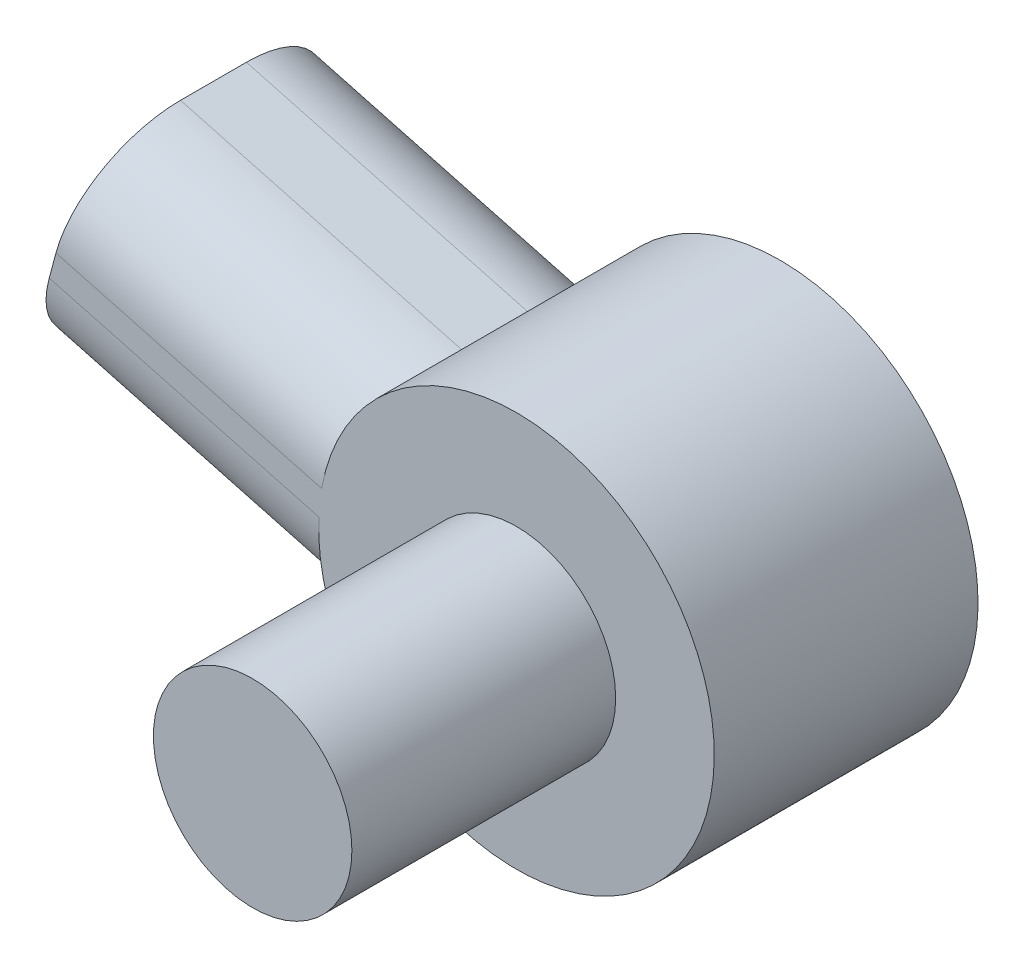
ISO-10303-21;
HEADER;
FILE_DESCRIPTION(('STEP AP214'),'2;1');
FILE_NAME('part.step','',(''),(''),'','','');
FILE_SCHEMA(('AUTOMOTIVE_DESIGN { 1 0 10303 214 1 1 1 1 }'));
ENDSEC;
DATA;
#1=APPLICATION_CONTEXT('core data for automotive mechanical design processes');
#2=APPLICATION_PROTOCOL_DEFINITION('international standard','automotive_design',2000,#1);
#3=PRODUCT_CONTEXT('',#1,'mechanical');
#4=PRODUCT('Part','Part','',(#3));
#5=PRODUCT_RELATED_PRODUCT_CATEGORY('part','',(#4));
#6=PRODUCT_DEFINITION_FORMATION('','',#4);
#7=PRODUCT_DEFINITION_CONTEXT('part definition',#1,'design');
#8=PRODUCT_DEFINITION('design','',#6,#7);
#9=PRODUCT_DEFINITION_SHAPE('','',#8);
#10=(LENGTH_UNIT() NAMED_UNIT(*) SI_UNIT(.MILLI.,.METRE.));
#11=(NAMED_UNIT(*) PLANE_ANGLE_UNIT() SI_UNIT($,.RADIAN.));
#12=(NAMED_UNIT(*) SI_UNIT($,.STERADIAN.) SOLID_ANGLE_UNIT());
#13=UNCERTAINTY_MEASURE_WITH_UNIT(LENGTH_MEASURE(1.E-05),#10,'distance_accuracy_value','');
#14=(GEOMETRIC_REPRESENTATION_CONTEXT(3) GLOBAL_UNCERTAINTY_ASSIGNED_CONTEXT((#13)) GLOBAL_UNIT_ASSIGNED_CONTEXT((#10,
#11,#12)) REPRESENTATION_CONTEXT('',''));
#15=CARTESIAN_POINT('',(0.,0.,0.));
#16=DIRECTION('',(0.,0.,1.));
#17=DIRECTION('',(1.,0.,0.));
#18=AXIS2_PLACEMENT_3D('',#15,#16,#17);
#19=CARTESIAN_POINT('',(0.,0.,40.));
#20=DIRECTION('',(0.,0.,-1.));
#21=DIRECTION('',(-1.,0.,0.));
#22=AXIS2_PLACEMENT_3D('',#19,#20,#21);
#23=CYLINDRICAL_SURFACE('',#22,30.);
#24=CARTESIAN_POINT('',(0.,0.,0.));
#25=DIRECTION('',(0.,0.,1.));
#26=DIRECTION('',(1.,0.,0.));
#27=AXIS2_PLACEMENT_3D('',#24,#25,#26);
#28=CIRCLE('',#27,30.);
#29=CARTESIAN_POINT('',(-29.9723416682267,1.2879188340418,0.));
#30=VERTEX_POINT('',#29);
#31=CARTESIAN_POINT('',(-29.5380367665379,5.24446222015701,0.));
#32=VERTEX_POINT('',#31);
#33=EDGE_CURVE('E246',#30,#32,#28,.T.);
#34=ORIENTED_EDGE('',*,*,#33,.T.);
#35=CARTESIAN_POINT('',(-29.5380367665379,5.24446222015701,0.));
#36=CARTESIAN_POINT('',(-29.5040298742118,5.43600938952069,-9.34321455274089E-07));
#37=CARTESIAN_POINT('',(-29.4681591276033,5.62720111431854,0.00375749956873188));
#38=CARTESIAN_POINT('',(-29.3927704158719,6.0085615714142,0.0188110233771672));
#39=CARTESIAN_POINT('',(-29.3532525309319,6.1987303261049,0.0301059476387477));
#40=CARTESIAN_POINT('',(-29.2293846402727,6.76707175898463,0.0753086741518917));
#41=CARTESIAN_POINT('',(-29.1396888723114,7.14325691219131,0.120534399265912));
#42=CARTESIAN_POINT('',(-28.9475324090227,7.88587231633328,0.240688901272383));
#43=CARTESIAN_POINT('',(-28.8451227233721,8.25233481975616,0.315501456023605));
#44=CARTESIAN_POINT('',(-28.6286440115631,8.97456673868699,0.494247181942344));
#45=CARTESIAN_POINT('',(-28.5145748173125,9.3303359999374,0.598180772978258));
#46=CARTESIAN_POINT('',(-28.2765017742877,10.0287347311496,0.834230105681024));
#47=CARTESIAN_POINT('',(-28.1525027062618,10.3713704081887,0.966332335862019));
#48=CARTESIAN_POINT('',(-27.896382282694,11.0417678835819,1.25765244409871));
#49=CARTESIAN_POINT('',(-27.7642603301094,11.369528585521,1.41687231686277));
#50=CARTESIAN_POINT('',(-27.4938405898555,12.0087152061614,1.7612644128485));
#51=CARTESIAN_POINT('',(-27.3555391232882,12.3201311477194,1.94645223990361));
#52=CARTESIAN_POINT('',(-27.0749564993345,12.9250891182478,2.341358796469));
#53=CARTESIAN_POINT('',(-26.9326752387043,13.2186306828925,2.55107816282625));
#54=CARTESIAN_POINT('',(-26.6403709770329,13.7985655802668,3.0028595348038));
#55=CARTESIAN_POINT('',(-26.4902718454218,14.0841558751815,3.24590296593351));
#56=CARTESIAN_POINT('',(-26.19059631518,14.6338894948064,3.75562077971601));
#57=CARTESIAN_POINT('',(-26.0410201156877,14.8980253541905,4.0223033209471));
#58=CARTESIAN_POINT('',(-25.744926957466,15.4040485972527,4.57780382549153));
#59=CARTESIAN_POINT('',(-25.5984112988858,15.6459266684223,4.86663096213937));
#60=CARTESIAN_POINT('',(-25.3110760333603,16.1066181047825,5.46478992482873));
#61=CARTESIAN_POINT('',(-25.1702566004075,16.3254307657618,5.77412237644975));
#62=CARTESIAN_POINT('',(-24.8863172039544,16.7553761888112,6.43643152008466));
#63=CARTESIAN_POINT('',(-24.7438624975403,16.9646043060998,6.79093320441269));
#64=CARTESIAN_POINT('',(-24.4718655802673,17.3546630194945,7.51973236904371));
#65=CARTESIAN_POINT('',(-24.3423176070276,17.5355063093207,7.89402089996671));
#66=CARTESIAN_POINT('',(-24.0993102914295,17.8680060381317,8.66006230931007));
#67=CARTESIAN_POINT('',(-23.9858402268388,18.0196819529518,9.05180331746626));
#68=CARTESIAN_POINT('',(-23.7779564421975,18.2931219564004,9.85028644618138));
#69=CARTESIAN_POINT('',(-23.6835323248362,18.414902373107,10.2570202378545));
#70=CARTESIAN_POINT('',(-23.529464244069,18.6112155218593,11.0181766988707));
#71=CARTESIAN_POINT('',(-23.4666907172566,18.6901583183827,11.3708366938674));
#72=CARTESIAN_POINT('',(-23.3579657422154,18.82585889499,12.0829163939464));
#73=CARTESIAN_POINT('',(-23.3120113844901,18.8826205122436,12.4423349185705));
#74=CARTESIAN_POINT('',(-23.2379039159704,18.9737579027069,13.1668453842967));
#75=CARTESIAN_POINT('',(-23.20980040846,19.0080713054938,13.5319502709901));
#76=CARTESIAN_POINT('',(-23.1721737974462,19.0538843476043,14.264693588261));
#77=CARTESIAN_POINT('',(-23.1626586294229,19.0653742434633,14.6323330336773));
#78=CARTESIAN_POINT('',(-23.1627387889613,19.0653489817088,15.));
#79=B_SPLINE_CURVE_WITH_KNOTS('',3,(#35,#36,#37,#38,#39,#40,#41,#42,#43,#44,#45,#46,#47,#48,#49,
#50,#51,#52,#53,#54,#55,#56,#57,#58,#59,#60,#61,#62,#63,#64,#65,#66,#67,#68,#69,#70,#71,#72,#73,
#74,#75,#76,#77,#78),.UNSPECIFIED.,.F.,.F.,(4,2,2,2,2,2,2,2,2,2,2,2,2,2,2,2,2,2,2,2,2,4),(0.,
0.583533249446237,1.16705367289728,2.33355609968314,3.49552110722352,4.65750286888922,
5.81892851833782,6.98043963638113,8.14265170743579,9.30489395660343,10.5154000198897,
11.7263255046408,12.9377553505335,14.1492221719505,15.4544380530298,16.7590685670647,
18.0628248963654,19.3658675584937,20.4652007406826,21.564343662602,22.6665276325884,
23.7691820291692),.UNSPECIFIED.);
#80=CARTESIAN_POINT('',(-23.1627387889613,19.0653489817088,15.));
#81=VERTEX_POINT('',#80);
#82=EDGE_CURVE('E55',#32,#81,#79,.T.);
#83=ORIENTED_EDGE('',*,*,#82,.T.);
#84=DIRECTION('',(0.,0.,-1.));
#85=VECTOR('',#84,1.);
#86=CARTESIAN_POINT('',(-23.1627387889613,19.0653489817088,40.));
#87=LINE('',#86,#85);
#88=CARTESIAN_POINT('',(-23.1627387889613,19.0653489817088,25.));
#89=VERTEX_POINT('',#88);
#90=EDGE_CURVE('E136',#89,#81,#87,.T.);
#91=ORIENTED_EDGE('',*,*,#90,.F.);
#92=CARTESIAN_POINT('',(-23.1627387889613,19.0653489817088,25.));
#93=CARTESIAN_POINT('',(-23.1627347387917,19.0653488769467,25.2017959847658));
#94=CARTESIAN_POINT('',(-23.1655827935163,19.0618943838357,25.4035647603579));
#95=CARTESIAN_POINT('',(-23.1769390505471,19.0480868433498,25.8066981161499));
#96=CARTESIAN_POINT('',(-23.1854470112908,19.0377340903899,26.0080627132321));
#97=CARTESIAN_POINT('',(-23.2193799326325,18.996361741299,26.6107832671496));
#98=CARTESIAN_POINT('',(-23.2532140491898,18.9550280218002,27.0110361541117));
#99=CARTESIAN_POINT('',(-23.3421396753012,18.8454086398059,27.8035472232149));
#100=CARTESIAN_POINT('',(-23.3971369453329,18.7772424319325,28.195832843941));
#101=CARTESIAN_POINT('',(-23.5268858169458,18.6144155684241,28.9715652079322));
#102=CARTESIAN_POINT('',(-23.601638930717,18.5197528846118,29.355011272139));
#103=CARTESIAN_POINT('',(-23.7688290181668,18.3046787665396,30.1099498735882));
#104=CARTESIAN_POINT('',(-23.8612379293737,18.1843081576624,30.4814603014155));
#105=CARTESIAN_POINT('',(-24.0616346384377,17.9182995716337,31.2111389641755));
#106=CARTESIAN_POINT('',(-24.169628403903,17.77265191128,31.5693020218547));
#107=CARTESIAN_POINT('',(-24.3988749319949,17.4566041653004,32.2705482771481));
#108=CARTESIAN_POINT('',(-24.5201399589788,17.286181135469,32.6136171082856));
#109=CARTESIAN_POINT('',(-24.7733499222019,16.921301311255,33.2826103520073));
#110=CARTESIAN_POINT('',(-24.9052954363671,16.7268432160239,33.6085338352726));
#111=CARTESIAN_POINT('',(-25.1851289828047,16.302682666068,34.2597891697585));
#112=CARTESIAN_POINT('',(-25.3334973264526,16.0715988477029,34.5840160695174));
#113=CARTESIAN_POINT('',(-25.636265095001,15.5841007769314,35.2095683923686));
#114=CARTESIAN_POINT('',(-25.7906620208879,15.3276969543626,35.5109031554551));
#115=CARTESIAN_POINT('',(-26.1026408166873,14.7901568970103,36.0891876150542));
#116=CARTESIAN_POINT('',(-26.2602242036376,14.509008657471,36.3661253435227));
#117=CARTESIAN_POINT('',(-26.5754768590152,13.9231684180015,36.8935395425375));
#118=CARTESIAN_POINT('',(-26.733146065755,13.6184861167695,37.1440268139861));
#119=CARTESIAN_POINT('',(-27.049840997167,12.9783254804686,37.6230864426515));
#120=CARTESIAN_POINT('',(-27.2087930338569,12.6422473047271,37.8509076302689));
#121=CARTESIAN_POINT('',(-27.5207109737241,11.9480229475489,38.2749516811998));
#122=CARTESIAN_POINT('',(-27.6736764350183,11.5898751421061,38.4711722153133));
#123=CARTESIAN_POINT('',(-27.970480888881,10.8540050015957,38.8299219181549));
#124=CARTESIAN_POINT('',(-28.1143295348747,10.4763041675332,38.9924871511125));
#125=CARTESIAN_POINT('',(-28.3902923112846,9.70357963045287,39.2824759269267));
#126=CARTESIAN_POINT('',(-28.5224096477602,9.30856070466633,39.4099090912184));
#127=CARTESIAN_POINT('',(-28.7386769033591,8.61295749180526,39.5987997513408));
#128=CARTESIAN_POINT('',(-28.8261443836387,8.31568436314456,39.6687805211474));
#129=CARTESIAN_POINT('',(-28.9927128119161,7.71490366759303,39.7889473665526));
#130=CARTESIAN_POINT('',(-29.0718155286523,7.41139743497317,39.8391376330245));
#131=CARTESIAN_POINT('',(-29.2210616661541,6.79917849307484,39.9195358729278));
#132=CARTESIAN_POINT('',(-29.2911940202439,6.49045987455981,39.9497193524045));
#133=CARTESIAN_POINT('',(-29.4219098132333,5.86961449937881,39.9899687453875));
#134=CARTESIAN_POINT('',(-29.482490497243,5.55748678711721,40.0000288646619));
#135=CARTESIAN_POINT('',(-29.5380367665379,5.24446222015701,40.));
#136=B_SPLINE_CURVE_WITH_KNOTS('',3,(#92,#93,#94,#95,#96,#97,#98,#99,#100,#101,#102,#103,#104,
#105,#106,#107,#108,#109,#110,#111,#112,#113,#114,#115,#116,#117,#118,#119,#120,#121,#122,#123,
#124,#125,#126,#127,#128,#129,#130,#131,#132,#133,#134,#135),.UNSPECIFIED.,.F.,.F.,(4,2,2,2,2,2,
2,2,2,2,2,2,2,2,2,2,2,2,2,2,2,4),(0.,0.605284388393846,1.2105429451521,2.42025242366854,
3.62463626414706,4.82911231962063,6.0316896477304,7.23472868347735,8.43888902326543,
9.64311456431584,10.916372362012,12.1891078488812,13.4624642434938,14.7352986425673,
16.0416647123202,17.3481270268123,18.6531820367038,19.9578792821817,20.9101806570061,
21.8622802623043,22.8155433638328,23.769080904269),.UNSPECIFIED.);
#137=CARTESIAN_POINT('',(-29.5380367665379,5.24446222015701,40.));
#138=VERTEX_POINT('',#137);
#139=EDGE_CURVE('E11',#89,#138,#136,.T.);
#140=ORIENTED_EDGE('',*,*,#139,.T.);
#141=CARTESIAN_POINT('',(0.,0.,40.));
#142=DIRECTION('',(0.,0.,1.));
#143=DIRECTION('',(1.,0.,0.));
#144=AXIS2_PLACEMENT_3D('',#141,#142,#143);
#145=CIRCLE('',#144,30.);
#146=CARTESIAN_POINT('',(-29.9723416682267,1.2879188340418,40.));
#147=VERTEX_POINT('',#146);
#148=EDGE_CURVE('E115',#147,#138,#145,.T.);
#149=ORIENTED_EDGE('',*,*,#148,.F.);
#150=CARTESIAN_POINT('',(-29.9723416682267,1.2879188340418,40.));
#151=CARTESIAN_POINT('',(-29.9816797288841,1.07067681006642,40.0000011424199));
#152=CARTESIAN_POINT('',(-29.9886474060978,0.853368587471598,39.9954939743698));
#153=CARTESIAN_POINT('',(-29.9978593088711,0.419035491370483,39.9776188777841));
#154=CARTESIAN_POINT('',(-30.0001039662614,0.202010593772931,39.9642517594701));
#155=CARTESIAN_POINT('',(-29.9997815156899,-0.447611494658615,39.9111308929285));
#156=CARTESIAN_POINT('',(-29.9901778807794,-0.879222670359713,39.8583569503837));
#157=CARTESIAN_POINT('',(-29.9529118398026,-1.73343889738543,39.7201309863874));
#158=CARTESIAN_POINT('',(-29.9253653149262,-2.1560838921921,39.6348901042609));
#159=CARTESIAN_POINT('',(-29.8533250619968,-2.99252532037701,39.4334623259692));
#160=CARTESIAN_POINT('',(-29.8088280676576,-3.40632003210101,39.3172694667831));
#161=CARTESIAN_POINT('',(-29.7043745073273,-4.22117764835699,39.0562158058931));
#162=CARTESIAN_POINT('',(-29.6444698334534,-4.62227830955136,38.9114516042627));
#163=CARTESIAN_POINT('',(-29.5106672456857,-5.41115366300297,38.5947825671082));
#164=CARTESIAN_POINT('',(-29.4367699632112,-5.79892895563768,38.4228789563136));
#165=CARTESIAN_POINT('',(-29.2765364505128,-6.56018308911379,38.0531985668372));
#166=CARTESIAN_POINT('',(-29.1901770787167,-6.93363365935811,37.8553737178057));
#167=CARTESIAN_POINT('',(-29.0069825964664,-7.6639896315953,37.4355258080058));
#168=CARTESIAN_POINT('',(-28.9101468603189,-8.02089404356022,37.2135013019243));
#169=CARTESIAN_POINT('',(-28.6957006785223,-8.75910175358296,36.7180519888661));
#170=CARTESIAN_POINT('',(-28.576995703764,-9.13809888947156,36.4416597051753));
#171=CARTESIAN_POINT('',(-28.3319373356292,-9.87172331718408,35.8612188908438));
#172=CARTESIAN_POINT('',(-28.205582876332,-10.2263471979374,35.5571665029132));
#173=CARTESIAN_POINT('',(-27.9485071578386,-10.9093612705963,34.9221705474088));
#174=CARTESIAN_POINT('',(-27.8177834234828,-11.2377362228538,34.5912115800485));
#175=CARTESIAN_POINT('',(-27.5558095638467,-11.8656228342028,33.9031921635203));
#176=CARTESIAN_POINT('',(-27.4245595489542,-12.1651402468898,33.5461369424746));
#177=CARTESIAN_POINT('',(-27.1897709318124,-12.6799438202551,32.8747716133739));
#178=CARTESIAN_POINT('',(-27.0855961897406,-12.9005637680529,32.5647671861863));
#179=CARTESIAN_POINT('',(-26.8824351294776,-13.3187343831304,31.9279818031009));
#180=CARTESIAN_POINT('',(-26.7834476610225,-13.5162901768557,31.6012045986068));
#181=CARTESIAN_POINT('',(-26.5940383626581,-13.8852423795778,30.9327311055116));
#182=CARTESIAN_POINT('',(-26.5035812033255,-14.0567486596185,30.5911057646524));
#183=CARTESIAN_POINT('',(-26.3339955316651,-14.3719425662355,29.892474032412));
#184=CARTESIAN_POINT('',(-26.2548662202886,-14.51563215521,29.5354687282228));
#185=CARTESIAN_POINT('',(-26.1182964965867,-14.7598187036298,28.8428838308992));
#186=CARTESIAN_POINT('',(-26.0594979656589,-14.8631505301312,28.5085761569345));
#187=CARTESIAN_POINT('',(-25.9563780713252,-15.0425118113802,27.8306285424223));
#188=CARTESIAN_POINT('',(-25.9120508260618,-15.1185523599262,27.4869924550791));
#189=CARTESIAN_POINT('',(-25.8394960736864,-15.2422347859996,26.7883377862948));
#190=CARTESIAN_POINT('',(-25.8114782076983,-15.2895072134989,26.4332303811767));
#191=CARTESIAN_POINT('',(-25.7832867469479,-15.3369625736292,25.8975906762106));
#192=CARTESIAN_POINT('',(-25.7761953434488,-15.348872277936,25.7183765017778));
#193=CARTESIAN_POINT('',(-25.7667199350514,-15.3647710198295,25.3594525720261));
#194=CARTESIAN_POINT('',(-25.7643364813439,-15.3687591299832,25.179742761146));
#195=CARTESIAN_POINT('',(-25.7643439000195,-15.3687534758525,25.));
#196=B_SPLINE_CURVE_WITH_KNOTS('',3,(#150,#151,#152,#153,#154,#155,#156,#157,#158,#159,#160,
#161,#162,#163,#164,#165,#166,#167,#168,#169,#170,#171,#172,#173,#174,#175,#176,#177,#178,#179,
#180,#181,#182,#183,#184,#185,#186,#187,#188,#189,#190,#191,#192,#193,#194,#195),.UNSPECIFIED.,
.F.,.F.,(4,2,2,2,2,2,2,2,2,2,2,2,2,2,2,2,2,2,2,2,2,2,4),(0.,0.652200713127473,1.30434179225267,
2.60722824490575,3.90178255252377,5.19658644175311,6.48708534642641,7.77752603094439,
9.07039460443171,10.3633404362393,11.8134188974838,13.2636998877005,14.7148168596607,
16.1656439076278,17.3481765652277,18.5304458800765,19.7075812249608,20.8846334955956,
21.9477297669813,23.0103934031091,24.0864309864952,24.6254719422728,25.1645760033909),.UNSPECIFIED.);
#197=CARTESIAN_POINT('',(-25.7643439000195,-15.3687534758525,25.));
#198=VERTEX_POINT('',#197);
#199=EDGE_CURVE('E111',#147,#198,#196,.T.);
#200=ORIENTED_EDGE('',*,*,#199,.T.);
#201=DIRECTION('',(0.,0.,-1.));
#202=VECTOR('',#201,1.);
#203=CARTESIAN_POINT('',(-25.7643439000195,-15.3687534758525,40.));
#204=LINE('',#203,#202);
#205=CARTESIAN_POINT('',(-25.7643439000195,-15.3687534758525,15.));
#206=VERTEX_POINT('',#205);
#207=EDGE_CURVE('E114',#198,#206,#204,.T.);
#208=ORIENTED_EDGE('',*,*,#207,.T.);
#209=CARTESIAN_POINT('',(-25.7643439000195,-15.3687534758525,15.));
#210=CARTESIAN_POINT('',(-25.7643370399188,-15.3687586963836,14.8236067017991));
#211=CARTESIAN_POINT('',(-25.7666321718647,-15.3649180995098,14.6472445802951));
#212=CARTESIAN_POINT('',(-25.7757585561039,-15.3496054694948,14.2949880088205));
#213=CARTESIAN_POINT('',(-25.7825893213161,-15.3381342558044,14.1190935106682));
#214=CARTESIAN_POINT('',(-25.8097527489144,-15.2924163916923,13.5932682207517));
#215=CARTESIAN_POINT('',(-25.8367570129455,-15.2468650784519,13.244584085336));
#216=CARTESIAN_POINT('',(-25.906769294577,-15.1275894441801,12.5580847835202));
#217=CARTESIAN_POINT('',(-25.9495857798383,-15.0542020230229,12.2201900856016));
#218=CARTESIAN_POINT('',(-26.0492940912593,-14.881002872553,11.553300808319));
#219=CARTESIAN_POINT('',(-26.1061903952634,-14.7811827360607,11.2243090973951));
#220=CARTESIAN_POINT('',(-26.231393470875,-14.5578239993987,10.5789604088616));
#221=CARTESIAN_POINT('',(-26.2996326701154,-14.4344252477358,10.2625415993825));
#222=CARTESIAN_POINT('',(-26.4453894468729,-14.1656209393632,9.64155721014711));
#223=CARTESIAN_POINT('',(-26.5229063504643,-14.0202169808932,9.3369907715703));
#224=CARTESIAN_POINT('',(-26.7665501521652,-13.5526752231597,8.43986586356055));
#225=CARTESIAN_POINT('',(-26.9433591917124,-13.1999137560668,7.86586598036445));
#226=CARTESIAN_POINT('',(-27.2590562865707,-12.5316107224042,6.92013199480066));
#227=CARTESIAN_POINT('',(-27.3951804606673,-12.2320370087666,6.53584340319559));
#228=CARTESIAN_POINT('',(-27.6686892802013,-11.6000893988725,5.79538601216335));
#229=CARTESIAN_POINT('',(-27.8060743526292,-11.2677039892862,5.43922716268557));
#230=CARTESIAN_POINT('',(-28.077641445638,-10.5728616825844,4.75555032425592));
#231=CARTESIAN_POINT('',(-28.2118201534126,-10.210375280092,4.42806109906721));
#232=CARTESIAN_POINT('',(-28.4728623526307,-9.45804532763801,3.80303917679386));
#233=CARTESIAN_POINT('',(-28.599726693607,-9.06820496643069,3.50550299778257));
#234=CARTESIAN_POINT('',(-28.843741228734,-8.25946103971608,2.93903183364269));
#235=CARTESIAN_POINT('',(-28.9607872719426,-7.84031581269483,2.67039659064824));
#236=CARTESIAN_POINT('',(-29.1804409148389,-6.97850954331278,2.16689871256088));
#237=CARTESIAN_POINT('',(-29.2830473110486,-6.53584654508486,1.93203889245768));
#238=CARTESIAN_POINT('',(-29.4704322175116,-5.63085576415498,1.49913849717159));
#239=CARTESIAN_POINT('',(-29.5552620912237,-5.16858941062553,1.30099204011671));
#240=CARTESIAN_POINT('',(-29.7046621332842,-4.22616343355329,0.943450215723158));
#241=CARTESIAN_POINT('',(-29.7692377469544,-3.74600865818575,0.784044435621507));
#242=CARTESIAN_POINT('',(-29.8625831705214,-2.89179989600485,0.54115859241409));
#243=CARTESIAN_POINT('',(-29.8962571048615,-2.52082555225068,0.448649909446847));
#244=CARTESIAN_POINT('',(-29.9499296248413,-1.77265019079731,0.288555515548079));
#245=CARTESIAN_POINT('',(-29.9699325139043,-1.39545117085124,0.2209619648265));
#246=CARTESIAN_POINT('',(-29.9957034784737,-0.634943535070261,0.111620978811748));
#247=CARTESIAN_POINT('',(-30.0014034029114,-0.251614394441816,0.0699979926109399));
#248=CARTESIAN_POINT('',(-29.9988579248873,0.324888949332643,0.0281367993218728));
#249=CARTESIAN_POINT('',(-29.9961563476339,0.517398588343578,0.0176118469346617));
#250=CARTESIAN_POINT('',(-29.9870380703753,0.902596979804,0.00354283822229027));
#251=CARTESIAN_POINT('',(-29.9806211254935,1.09528574322359,-7.57899940490773E-07));
#252=CARTESIAN_POINT('',(-29.9723416682267,1.2879188340418,0.));
#253=B_SPLINE_CURVE_WITH_KNOTS('',3,(#209,#210,#211,#212,#213,#214,#215,#216,#217,#218,#219,
#220,#221,#222,#223,#224,#225,#226,#227,#228,#229,#230,#231,#232,#233,#234,#235,#236,#237,#238,
#239,#240,#241,#242,#243,#244,#245,#246,#247,#248,#249,#250,#251,#252),.UNSPECIFIED.,.F.,.F.,(4,
2,2,2,2,2,2,2,2,2,2,2,2,2,2,2,2,2,2,2,2,4),(0.,0.529062369423851,1.05806793208917,
2.11425280473757,3.15804274306163,4.20216506841354,5.24027667679626,6.27831292321448,
8.36076180765096,9.87687936298277,11.3935308142564,12.911686863686,14.4296662290207,
15.9621185924258,17.4946986031058,19.0227873875879,20.5504649952704,21.7008904432194,
22.8509535889052,24.0064862626625,24.5847929735936,25.1631378045587),.UNSPECIFIED.);
#254=EDGE_CURVE('E120',#206,#30,#253,.T.);
#255=ORIENTED_EDGE('',*,*,#254,.T.);
#256=EDGE_LOOP('',(#34,#83,#91,#140,#149,#200,#208,#255));
#257=FACE_BOUND('',#256,.T.);
#258=ADVANCED_FACE('F41',(#257),#23,.T.);
#259=CARTESIAN_POINT('',(-23.1627387889613,19.0653489817088,40.));
#260=DIRECTION('',(-0.258819045102518,-0.965925826289069,0.));
#261=DIRECTION('',(0.965925826289069,-0.258819045102518,0.));
#262=AXIS2_PLACEMENT_3D('',#259,#260,#261);
#263=PLANE('',#262);
#264=ORIENTED_EDGE('',*,*,#90,.T.);
#265=DIRECTION('',(-0.965925826289069,0.258819045102518,0.));
#266=VECTOR('',#265,1.);
#267=CARTESIAN_POINT('',(-23.1627387889613,19.0653489817088,15.));
#268=LINE('',#267,#266);
#269=CARTESIAN_POINT('',(-65.9428353615626,30.5282413104626,15.));
#270=VERTEX_POINT('',#269);
#271=EDGE_CURVE('E161',#81,#270,#268,.T.);
#272=ORIENTED_EDGE('',*,*,#271,.T.);
#273=DIRECTION('',(0.,0.,-1.));
#274=VECTOR('',#273,1.);
#275=CARTESIAN_POINT('',(-65.9428353615626,30.5282413104626,40.));
#276=LINE('',#275,#274);
#277=CARTESIAN_POINT('',(-65.9428353615626,30.5282413104626,25.));
#278=VERTEX_POINT('',#277);
#279=EDGE_CURVE('E140',#278,#270,#276,.T.);
#280=ORIENTED_EDGE('',*,*,#279,.F.);
#281=DIRECTION('',(-0.965925826289069,0.258819045102518,0.));
#282=VECTOR('',#281,1.);
#283=CARTESIAN_POINT('',(-23.1627387889613,19.0653489817088,25.));
#284=LINE('',#283,#282);
#285=EDGE_CURVE('E68',#278,#89,#284,.F.);
#286=ORIENTED_EDGE('',*,*,#285,.T.);
#287=EDGE_LOOP('',(#264,#272,#280,#286));
#288=FACE_BOUND('',#287,.T.);
#289=ADVANCED_FACE('F197',(#288),#263,.F.);
#290=CARTESIAN_POINT('',(-74.725635473086,-2.24961493846478,40.));
#291=DIRECTION('',(0.965925826289069,-0.258819045102517,0.));
#292=DIRECTION('',(0.258819045102517,0.965925826289069,0.));
#293=AXIS2_PLACEMENT_3D('',#290,#291,#292);
#294=PLANE('',#293);
#295=CARTESIAN_POINT('',(-70.3342354173243,14.1393131859989,20.));
#296=DIRECTION('',(-0.965925826289069,0.258819045102518,0.));
#297=DIRECTION('',(-0.258819045102518,-0.965925826289069,0.));
#298=AXIS2_PLACEMENT_3D('',#295,#296,#297);
#299=CIRCLE('',#298,15.05);
#300=CARTESIAN_POINT('',(-74.2294620461172,-0.397870499651554,20.));
#301=VERTEX_POINT('',#300);
#302=EDGE_CURVE('E236',#301,#301,#299,.T.);
#303=ORIENTED_EDGE('',*,*,#302,.F.);
#304=EDGE_LOOP('',(#303));
#305=FACE_BOUND('',#304,.T.);
#306=DIRECTION('',(-0.258819045102517,-0.965925826289069,0.));
#307=VECTOR('',#306,1.);
#308=CARTESIAN_POINT('',(-74.725635473086,-2.24961493846478,0.));
#309=LINE('',#308,#307);
#310=CARTESIAN_POINT('',(-69.8251210381003,16.0393539161266,0.));
#311=VERTEX_POINT('',#310);
#312=CARTESIAN_POINT('',(-70.8433497965482,12.2392724558713,0.));
#313=VERTEX_POINT('',#312);
#314=EDGE_CURVE('E249',#311,#313,#309,.T.);
#315=ORIENTED_EDGE('',*,*,#314,.T.);
#316=CARTESIAN_POINT('',(-70.8433497965482,12.2392724558713,15.));
#317=DIRECTION('',(0.965925826289069,-0.258819045102517,0.));
#318=DIRECTION('',(0.258819045102517,0.965925826289069,0.));
#319=AXIS2_PLACEMENT_3D('',#316,#317,#318);
#320=CIRCLE('',#319,15.);
#321=CARTESIAN_POINT('',(-74.725635473086,-2.24961493846478,15.));
#322=VERTEX_POINT('',#321);
#323=EDGE_CURVE('E153',#313,#322,#320,.F.);
#324=ORIENTED_EDGE('',*,*,#323,.T.);
#325=DIRECTION('',(0.,0.,-1.));
#326=VECTOR('',#325,1.);
#327=CARTESIAN_POINT('',(-74.725635473086,-2.24961493846478,40.));
#328=LINE('',#327,#326);
#329=CARTESIAN_POINT('',(-74.725635473086,-2.24961493846478,25.));
#330=VERTEX_POINT('',#329);
#331=EDGE_CURVE('E130',#330,#322,#328,.T.);
#332=ORIENTED_EDGE('',*,*,#331,.F.);
#333=CARTESIAN_POINT('',(-70.8433497965482,12.2392724558713,25.));
#334=DIRECTION('',(0.965925826289069,-0.258819045102517,0.));
#335=DIRECTION('',(0.258819045102517,0.965925826289069,0.));
#336=AXIS2_PLACEMENT_3D('',#333,#334,#335);
#337=CIRCLE('',#336,15.);
#338=CARTESIAN_POINT('',(-70.8433497965482,12.2392724558713,40.));
#339=VERTEX_POINT('',#338);
#340=EDGE_CURVE('E135',#330,#339,#337,.F.);
#341=ORIENTED_EDGE('',*,*,#340,.T.);
#342=DIRECTION('',(-0.258819045102517,-0.965925826289069,0.));
#343=VECTOR('',#342,1.);
#344=CARTESIAN_POINT('',(-74.725635473086,-2.24961493846478,40.));
#345=LINE('',#344,#343);
#346=CARTESIAN_POINT('',(-69.8251210381003,16.0393539161266,40.));
#347=VERTEX_POINT('',#346);
#348=EDGE_CURVE('E131',#347,#339,#345,.T.);
#349=ORIENTED_EDGE('',*,*,#348,.F.);
#350=CARTESIAN_POINT('',(-69.8251210381003,16.0393539161266,25.));
#351=DIRECTION('',(0.965925826289069,-0.258819045102517,0.));
#352=DIRECTION('',(0.258819045102517,0.965925826289069,0.));
#353=AXIS2_PLACEMENT_3D('',#350,#351,#352);
#354=CIRCLE('',#353,15.);
#355=EDGE_CURVE('E148',#347,#278,#354,.F.);
#356=ORIENTED_EDGE('',*,*,#355,.T.);
#357=ORIENTED_EDGE('',*,*,#279,.T.);
#358=CARTESIAN_POINT('',(-69.8251210381003,16.0393539161266,15.));
#359=DIRECTION('',(0.965925826289069,-0.258819045102517,0.));
#360=DIRECTION('',(0.258819045102517,0.965925826289069,0.));
#361=AXIS2_PLACEMENT_3D('',#358,#359,#360);
#362=CIRCLE('',#361,15.);
#363=EDGE_CURVE('E150',#270,#311,#362,.F.);
#364=ORIENTED_EDGE('',*,*,#363,.T.);
#365=EDGE_LOOP('',(#315,#324,#332,#341,#349,#356,#357,#364));
#366=FACE_BOUND('',#365,.T.);
#367=ADVANCED_FACE('F201',(#305,#366),#294,.F.);
#368=CARTESIAN_POINT('',(-25.7643439000195,-15.3687534758525,40.));
#369=DIRECTION('',(0.258819045102518,0.965925826289069,0.));
#370=DIRECTION('',(-0.965925826289069,0.258819045102518,0.));
#371=AXIS2_PLACEMENT_3D('',#368,#369,#370);
#372=PLANE('',#371);
#373=ORIENTED_EDGE('',*,*,#331,.T.);
#374=DIRECTION('',(0.965925826289069,-0.258819045102518,0.));
#375=VECTOR('',#374,1.);
#376=CARTESIAN_POINT('',(-25.7643439000195,-15.3687534758525,15.));
#377=LINE('',#376,#375);
#378=EDGE_CURVE('E129',#322,#206,#377,.T.);
#379=ORIENTED_EDGE('',*,*,#378,.T.);
#380=ORIENTED_EDGE('',*,*,#207,.F.);
#381=DIRECTION('',(0.965925826289069,-0.258819045102518,0.));
#382=VECTOR('',#381,1.);
#383=CARTESIAN_POINT('',(-74.725635473086,-2.24961493846478,25.));
#384=LINE('',#383,#382);
#385=EDGE_CURVE('E126',#198,#330,#384,.F.);
#386=ORIENTED_EDGE('',*,*,#385,.T.);
#387=EDGE_LOOP('',(#373,#379,#380,#386));
#388=FACE_BOUND('',#387,.T.);
#389=ADVANCED_FACE('F125',(#388),#372,.F.);
#390=CARTESIAN_POINT('',(0.,0.,40.));
#391=DIRECTION('',(0.,0.,1.));
#392=DIRECTION('',(1.,0.,0.));
#393=AXIS2_PLACEMENT_3D('',#390,#391,#392);
#394=PLANE('',#393);
#395=CARTESIAN_POINT('',(0.,0.,40.));
#396=DIRECTION('',(0.,0.,1.));
#397=DIRECTION('',(1.,0.,0.));
#398=AXIS2_PLACEMENT_3D('',#395,#396,#397);
#399=CIRCLE('',#398,15.05);
#400=CARTESIAN_POINT('',(15.05,0.,40.));
#401=VERTEX_POINT('',#400);
#402=EDGE_CURVE('E237',#401,#401,#399,.T.);
#403=ORIENTED_EDGE('',*,*,#402,.F.);
#404=EDGE_LOOP('',(#403));
#405=FACE_BOUND('',#404,.T.);
#406=ORIENTED_EDGE('',*,*,#348,.T.);
#407=DIRECTION('',(0.965925826289069,-0.258819045102518,0.));
#408=VECTOR('',#407,1.);
#409=CARTESIAN_POINT('',(-21.8820582234817,-0.879866081516485,40.));
#410=LINE('',#409,#408);
#411=EDGE_CURVE('E158',#339,#147,#410,.T.);
#412=ORIENTED_EDGE('',*,*,#411,.T.);
#413=ORIENTED_EDGE('',*,*,#148,.T.);
#414=DIRECTION('',(-0.965925826289069,0.258819045102518,0.));
#415=VECTOR('',#414,1.);
#416=CARTESIAN_POINT('',(-69.8251210381003,16.0393539161266,40.));
#417=LINE('',#416,#415);
#418=EDGE_CURVE('E155',#138,#347,#417,.T.);
#419=ORIENTED_EDGE('',*,*,#418,.T.);
#420=EDGE_LOOP('',(#406,#412,#413,#419));
#421=FACE_BOUND('',#420,.T.);
#422=ADVANCED_FACE('F210',(#405,#421),#394,.T.);
#423=CARTESIAN_POINT('',(0.,0.,0.));
#424=DIRECTION('',(0.,0.,1.));
#425=DIRECTION('',(1.,0.,0.));
#426=AXIS2_PLACEMENT_3D('',#423,#424,#425);
#427=PLANE('',#426);
#428=ORIENTED_EDGE('',*,*,#33,.F.);
#429=DIRECTION('',(0.965925826289069,-0.258819045102518,0.));
#430=VECTOR('',#429,1.);
#431=CARTESIAN_POINT('',(-1.68578647780727,-6.29144078588939,0.));
#432=LINE('',#431,#430);
#433=EDGE_CURVE('E146',#30,#313,#432,.F.);
#434=ORIENTED_EDGE('',*,*,#433,.T.);
#435=ORIENTED_EDGE('',*,*,#314,.F.);
#436=DIRECTION('',(-0.965925826289069,0.258819045102518,0.));
#437=VECTOR('',#436,1.);
#438=CARTESIAN_POINT('',(-0.667557719359378,-2.49135932563404,0.));
#439=LINE('',#438,#437);
#440=EDGE_CURVE('E138',#311,#32,#439,.F.);
#441=ORIENTED_EDGE('',*,*,#440,.T.);
#442=EDGE_LOOP('',(#428,#434,#435,#441));
#443=FACE_BOUND('',#442,.T.);
#444=ADVANCED_FACE('F211',(#443),#427,.F.);
#445=CARTESIAN_POINT('',(-31.6972023657615,3.78655138189822,20.));
#446=DIRECTION('',(-0.965925826289069,0.258819045102518,0.));
#447=DIRECTION('',(-0.258819045102518,-0.965925826289069,0.));
#448=AXIS2_PLACEMENT_3D('',#445,#446,#447);
#449=CYLINDRICAL_SURFACE('',#448,15.05);
#450=CARTESIAN_POINT('',(-31.6972023657615,3.78655138189822,20.));
#451=DIRECTION('',(-0.965925826289069,0.258819045102518,0.));
#452=DIRECTION('',(-0.258819045102518,-0.965925826289069,0.));
#453=AXIS2_PLACEMENT_3D('',#450,#451,#452);
#454=CIRCLE('',#453,15.05);
#455=CARTESIAN_POINT('',(-35.5924289945544,-10.7506323037523,20.));
#456=VERTEX_POINT('',#455);
#457=EDGE_CURVE('E240',#456,#456,#454,.T.);
#458=ORIENTED_EDGE('',*,*,#457,.F.);
#459=EDGE_LOOP('',(#458));
#460=FACE_BOUND('',#459,.T.);
#461=ORIENTED_EDGE('',*,*,#302,.T.);
#462=EDGE_LOOP('',(#461));
#463=FACE_BOUND('',#462,.T.);
#464=ADVANCED_FACE('F214',(#460,#463),#449,.F.);
#465=CARTESIAN_POINT('',(-31.6972023657615,3.78655138189822,20.));
#466=DIRECTION('',(-0.965925826289069,0.258819045102518,0.));
#467=DIRECTION('',(-0.258819045102518,-0.965925826289069,0.));
#468=AXIS2_PLACEMENT_3D('',#465,#466,#467);
#469=PLANE('',#468);
#470=ORIENTED_EDGE('',*,*,#457,.T.);
#471=EDGE_LOOP('',(#470));
#472=FACE_BOUND('',#471,.T.);
#473=ADVANCED_FACE('F179',(#472),#469,.T.);
#474=CARTESIAN_POINT('',(-21.8820582234817,-0.879866081516484,15.));
#475=DIRECTION('',(0.965925826289069,-0.258819045102518,0.));
#476=DIRECTION('',(0.258819045102518,0.965925826289069,0.));
#477=AXIS2_PLACEMENT_3D('',#474,#475,#476);
#478=CYLINDRICAL_SURFACE('',#477,15.);
#479=ORIENTED_EDGE('',*,*,#323,.F.);
#480=ORIENTED_EDGE('',*,*,#433,.F.);
#481=ORIENTED_EDGE('',*,*,#254,.F.);
#482=ORIENTED_EDGE('',*,*,#378,.F.);
#483=EDGE_LOOP('',(#479,#480,#481,#482));
#484=FACE_BOUND('',#483,.T.);
#485=ADVANCED_FACE('F176',(#484),#478,.T.);
#486=CARTESIAN_POINT('',(-1.68578647780727,-6.29144078588939,25.));
#487=DIRECTION('',(-0.965925826289069,0.258819045102518,0.));
#488=DIRECTION('',(-0.258819045102518,-0.965925826289069,0.));
#489=AXIS2_PLACEMENT_3D('',#486,#487,#488);
#490=CYLINDRICAL_SURFACE('',#489,15.);
#491=ORIENTED_EDGE('',*,*,#340,.F.);
#492=ORIENTED_EDGE('',*,*,#385,.F.);
#493=ORIENTED_EDGE('',*,*,#199,.F.);
#494=ORIENTED_EDGE('',*,*,#411,.F.);
#495=EDGE_LOOP('',(#491,#492,#493,#494));
#496=FACE_BOUND('',#495,.T.);
#497=ADVANCED_FACE('F134',(#496),#490,.T.);
#498=CARTESIAN_POINT('',(-27.0450244654991,4.57646158737281,15.));
#499=DIRECTION('',(-0.965925826289069,0.258819045102518,0.));
#500=DIRECTION('',(-0.258819045102518,-0.965925826289069,0.));
#501=AXIS2_PLACEMENT_3D('',#498,#499,#500);
#502=CYLINDRICAL_SURFACE('',#501,15.);
#503=ORIENTED_EDGE('',*,*,#82,.F.);
#504=ORIENTED_EDGE('',*,*,#440,.F.);
#505=ORIENTED_EDGE('',*,*,#363,.F.);
#506=ORIENTED_EDGE('',*,*,#271,.F.);
#507=EDGE_LOOP('',(#503,#504,#505,#506));
#508=FACE_BOUND('',#507,.T.);
#509=ADVANCED_FACE('F183',(#508),#502,.T.);
#510=CARTESIAN_POINT('',(-0.667557719359378,-2.49135932563404,25.));
#511=DIRECTION('',(0.965925826289069,-0.258819045102518,0.));
#512=DIRECTION('',(0.258819045102518,0.965925826289069,0.));
#513=AXIS2_PLACEMENT_3D('',#510,#511,#512);
#514=CYLINDRICAL_SURFACE('',#513,15.);
#515=ORIENTED_EDGE('',*,*,#139,.F.);
#516=ORIENTED_EDGE('',*,*,#285,.F.);
#517=ORIENTED_EDGE('',*,*,#355,.F.);
#518=ORIENTED_EDGE('',*,*,#418,.F.);
#519=EDGE_LOOP('',(#515,#516,#517,#518));
#520=FACE_BOUND('',#519,.T.);
#521=ADVANCED_FACE('F43',(#520),#514,.T.);
#522=CARTESIAN_POINT('',(0.,0.,80.));
#523=DIRECTION('',(0.,0.,-1.));
#524=DIRECTION('',(-1.,0.,0.));
#525=AXIS2_PLACEMENT_3D('',#522,#523,#524);
#526=CYLINDRICAL_SURFACE('',#525,15.05);
#527=CARTESIAN_POINT('',(0.,0.,80.));
#528=DIRECTION('',(0.,0.,1.));
#529=DIRECTION('',(1.,0.,0.));
#530=AXIS2_PLACEMENT_3D('',#527,#528,#529);
#531=CIRCLE('',#530,15.05);
#532=CARTESIAN_POINT('',(15.05,0.,80.));
#533=VERTEX_POINT('',#532);
#534=EDGE_CURVE('E235',#533,#533,#531,.T.);
#535=ORIENTED_EDGE('',*,*,#534,.F.);
#536=EDGE_LOOP('',(#535));
#537=FACE_BOUND('',#536,.T.);
#538=ORIENTED_EDGE('',*,*,#402,.T.);
#539=EDGE_LOOP('',(#538));
#540=FACE_BOUND('',#539,.T.);
#541=ADVANCED_FACE('F194',(#537,#540),#526,.T.);
#542=CARTESIAN_POINT('',(0.,0.,80.));
#543=DIRECTION('',(0.,0.,1.));
#544=DIRECTION('',(1.,0.,0.));
#545=AXIS2_PLACEMENT_3D('',#542,#543,#544);
#546=PLANE('',#545);
#547=ORIENTED_EDGE('',*,*,#534,.T.);
#548=EDGE_LOOP('',(#547));
#549=FACE_BOUND('',#548,.T.);
#550=ADVANCED_FACE('F227',(#549),#546,.T.);
#551=CLOSED_SHELL('',(#258,#289,#367,#389,#422,#444,#464,#473,#485,#497,#509,#521,#541,#550));
#552=MANIFOLD_SOLID_BREP('B2',#551);
#553=ADVANCED_BREP_SHAPE_REPRESENTATION('',(#18,#552),#14);
#554=SHAPE_DEFINITION_REPRESENTATION(#9,#553);
ENDSEC;
END-ISO-10303-21;
